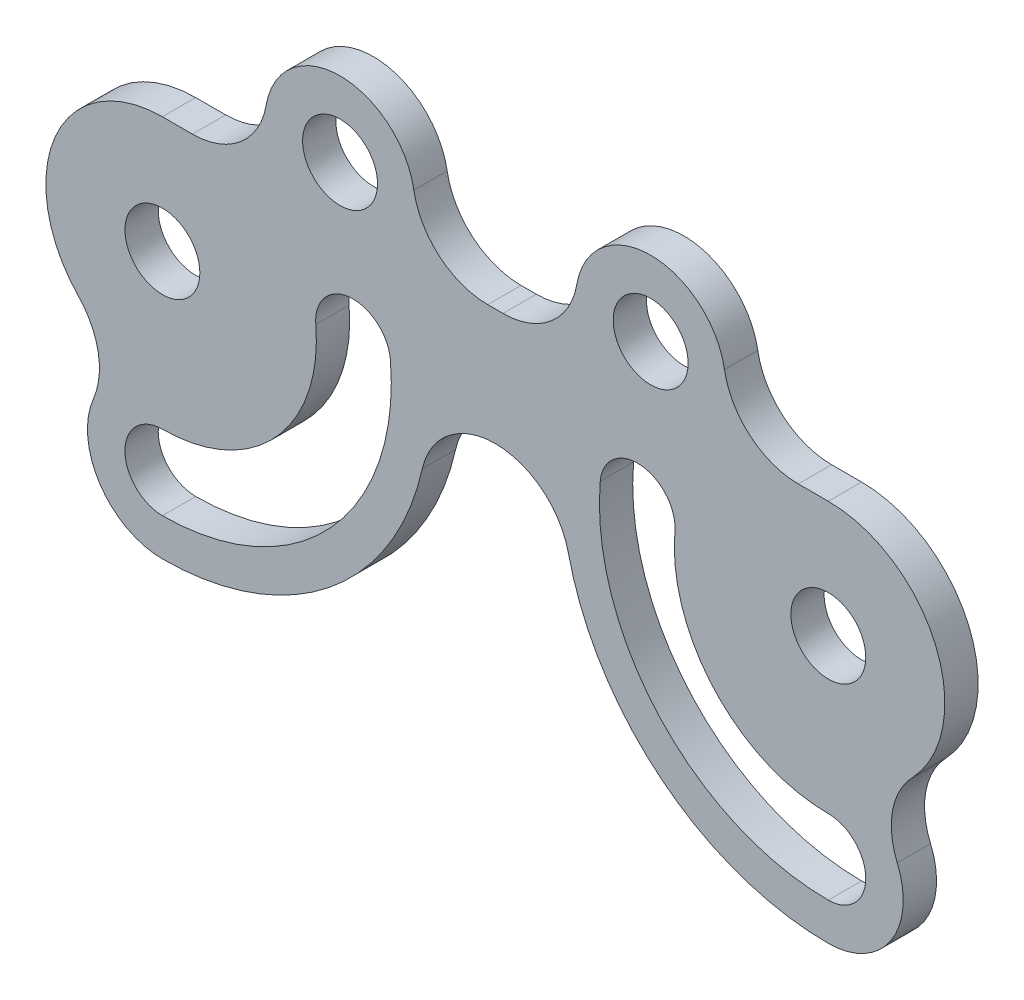
ISO-10303-21;
HEADER;
FILE_DESCRIPTION(('STEP AP214'),'2;1');
FILE_NAME('part.step','',(''),(''),'','','');
FILE_SCHEMA(('AUTOMOTIVE_DESIGN { 1 0 10303 214 1 1 1 1 }'));
ENDSEC;
DATA;
#1=APPLICATION_CONTEXT('core data for automotive mechanical design processes');
#2=APPLICATION_PROTOCOL_DEFINITION('international standard','automotive_design',2000,#1);
#3=PRODUCT_CONTEXT('',#1,'mechanical');
#4=PRODUCT('Part','Part','',(#3));
#5=PRODUCT_RELATED_PRODUCT_CATEGORY('part','',(#4));
#6=PRODUCT_DEFINITION_FORMATION('','',#4);
#7=PRODUCT_DEFINITION_CONTEXT('part definition',#1,'design');
#8=PRODUCT_DEFINITION('design','',#6,#7);
#9=PRODUCT_DEFINITION_SHAPE('','',#8);
#10=(LENGTH_UNIT() NAMED_UNIT(*) SI_UNIT(.MILLI.,.METRE.));
#11=(NAMED_UNIT(*) PLANE_ANGLE_UNIT() SI_UNIT($,.RADIAN.));
#12=(NAMED_UNIT(*) SI_UNIT($,.STERADIAN.) SOLID_ANGLE_UNIT());
#13=UNCERTAINTY_MEASURE_WITH_UNIT(LENGTH_MEASURE(1.E-05),#10,'distance_accuracy_value','');
#14=(GEOMETRIC_REPRESENTATION_CONTEXT(3) GLOBAL_UNCERTAINTY_ASSIGNED_CONTEXT((#13)) GLOBAL_UNIT_ASSIGNED_CONTEXT((#10,
#11,#12)) REPRESENTATION_CONTEXT('',''));
#15=CARTESIAN_POINT('',(0.,0.,0.));
#16=DIRECTION('',(0.,0.,1.));
#17=DIRECTION('',(1.,0.,0.));
#18=AXIS2_PLACEMENT_3D('',#15,#16,#17);
#19=CARTESIAN_POINT('',(0.,-9.12812499999999,1.5875));
#20=DIRECTION('',(0.,0.,-1.));
#21=DIRECTION('',(-1.,0.,0.));
#22=AXIS2_PLACEMENT_3D('',#19,#20,#21);
#23=CYLINDRICAL_SURFACE('',#22,1.7859375);
#24=CARTESIAN_POINT('',(0.,-9.12812499999999,0.));
#25=DIRECTION('',(0.,0.,1.));
#26=DIRECTION('',(1.,0.,0.));
#27=AXIS2_PLACEMENT_3D('',#24,#25,#26);
#28=CIRCLE('',#27,1.7859375);
#29=CARTESIAN_POINT('',(0.,-7.34218749999999,0.));
#30=VERTEX_POINT('',#29);
#31=CARTESIAN_POINT('',(0.,-10.9140625,0.));
#32=VERTEX_POINT('',#31);
#33=EDGE_CURVE('E378',#30,#32,#28,.T.);
#34=ORIENTED_EDGE('',*,*,#33,.F.);
#35=DIRECTION('',(0.,0.,-1.));
#36=VECTOR('',#35,1.);
#37=CARTESIAN_POINT('',(0.,-7.34218749999999,1.5875));
#38=LINE('',#37,#36);
#39=CARTESIAN_POINT('',(0.,-7.34218749999999,1.5875));
#40=VERTEX_POINT('',#39);
#41=EDGE_CURVE('E415',#40,#30,#38,.T.);
#42=ORIENTED_EDGE('',*,*,#41,.F.);
#43=CARTESIAN_POINT('',(0.,-9.12812499999999,1.5875));
#44=DIRECTION('',(0.,0.,1.));
#45=DIRECTION('',(1.,0.,0.));
#46=AXIS2_PLACEMENT_3D('',#43,#44,#45);
#47=CIRCLE('',#46,1.7859375);
#48=CARTESIAN_POINT('',(0.,-10.9140625,1.5875));
#49=VERTEX_POINT('',#48);
#50=EDGE_CURVE('E296',#40,#49,#47,.T.);
#51=ORIENTED_EDGE('',*,*,#50,.T.);
#52=DIRECTION('',(0.,0.,-1.));
#53=VECTOR('',#52,1.);
#54=CARTESIAN_POINT('',(0.,-10.9140625,1.5875));
#55=LINE('',#54,#53);
#56=EDGE_CURVE('E405',#49,#32,#55,.T.);
#57=ORIENTED_EDGE('',*,*,#56,.T.);
#58=EDGE_LOOP('',(#34,#42,#51,#57));
#59=FACE_BOUND('',#58,.T.);
#60=ADVANCED_FACE('F41',(#59),#23,.F.);
#61=CARTESIAN_POINT('',(0.,0.,1.5875));
#62=DIRECTION('',(0.,0.,-1.));
#63=DIRECTION('',(-1.,0.,0.));
#64=AXIS2_PLACEMENT_3D('',#61,#62,#63);
#65=CYLINDRICAL_SURFACE('',#64,7.34218749999999);
#66=CARTESIAN_POINT('',(0.,0.,0.));
#67=DIRECTION('',(0.,0.,1.));
#68=DIRECTION('',(1.,0.,0.));
#69=AXIS2_PLACEMENT_3D('',#66,#67,#68);
#70=CIRCLE('',#69,7.34218749999999);
#71=CARTESIAN_POINT('',(7.31424825989547,0.639913804955097,0.));
#72=VERTEX_POINT('',#71);
#73=EDGE_CURVE('E382',#72,#30,#70,.F.);
#74=ORIENTED_EDGE('',*,*,#73,.F.);
#75=DIRECTION('',(0.,0.,-1.));
#76=VECTOR('',#75,1.);
#77=CARTESIAN_POINT('',(7.31424825989547,0.639913804955097,1.5875));
#78=LINE('',#77,#76);
#79=CARTESIAN_POINT('',(7.31424825989547,0.639913804955097,1.5875));
#80=VERTEX_POINT('',#79);
#81=EDGE_CURVE('E412',#80,#72,#78,.T.);
#82=ORIENTED_EDGE('',*,*,#81,.F.);
#83=CARTESIAN_POINT('',(0.,0.,1.5875));
#84=DIRECTION('',(0.,0.,1.));
#85=DIRECTION('',(1.,0.,0.));
#86=AXIS2_PLACEMENT_3D('',#83,#84,#85);
#87=CIRCLE('',#86,7.34218749999999);
#88=EDGE_CURVE('E300',#80,#40,#87,.F.);
#89=ORIENTED_EDGE('',*,*,#88,.T.);
#90=ORIENTED_EDGE('',*,*,#41,.T.);
#91=EDGE_LOOP('',(#74,#82,#89,#90));
#92=FACE_BOUND('',#91,.T.);
#93=ADVANCED_FACE('F605',(#92),#65,.T.);
#94=CARTESIAN_POINT('',(9.0933897285187,0.7955685142685,1.5875));
#95=DIRECTION('',(0.,0.,-1.));
#96=DIRECTION('',(-1.,0.,0.));
#97=AXIS2_PLACEMENT_3D('',#94,#95,#96);
#98=CYLINDRICAL_SURFACE('',#97,1.7859375);
#99=CARTESIAN_POINT('',(9.0933897285187,0.7955685142685,0.));
#100=DIRECTION('',(0.,0.,1.));
#101=DIRECTION('',(1.,0.,0.));
#102=AXIS2_PLACEMENT_3D('',#99,#100,#101);
#103=CIRCLE('',#102,1.7859375);
#104=CARTESIAN_POINT('',(10.8725311971419,0.951223223581902,0.));
#105=VERTEX_POINT('',#104);
#106=EDGE_CURVE('E386',#105,#72,#103,.T.);
#107=ORIENTED_EDGE('',*,*,#106,.F.);
#108=DIRECTION('',(0.,0.,-1.));
#109=VECTOR('',#108,1.);
#110=CARTESIAN_POINT('',(10.8725311971419,0.951223223581902,1.5875));
#111=LINE('',#110,#109);
#112=CARTESIAN_POINT('',(10.8725311971419,0.951223223581902,1.5875));
#113=VERTEX_POINT('',#112);
#114=EDGE_CURVE('E408',#113,#105,#111,.T.);
#115=ORIENTED_EDGE('',*,*,#114,.F.);
#116=CARTESIAN_POINT('',(9.0933897285187,0.7955685142685,1.5875));
#117=DIRECTION('',(0.,0.,1.));
#118=DIRECTION('',(1.,0.,0.));
#119=AXIS2_PLACEMENT_3D('',#116,#117,#118);
#120=CIRCLE('',#119,1.7859375);
#121=EDGE_CURVE('E304',#113,#80,#120,.T.);
#122=ORIENTED_EDGE('',*,*,#121,.T.);
#123=ORIENTED_EDGE('',*,*,#81,.T.);
#124=EDGE_LOOP('',(#107,#115,#122,#123));
#125=FACE_BOUND('',#124,.T.);
#126=ADVANCED_FACE('F611',(#125),#98,.F.);
#127=CARTESIAN_POINT('',(0.,0.,1.5875));
#128=DIRECTION('',(0.,0.,-1.));
#129=DIRECTION('',(-1.,0.,0.));
#130=AXIS2_PLACEMENT_3D('',#127,#128,#129);
#131=CYLINDRICAL_SURFACE('',#130,5.55625);
#132=CARTESIAN_POINT('',(0.,0.,0.));
#133=DIRECTION('',(0.,0.,1.));
#134=DIRECTION('',(1.,0.,0.));
#135=AXIS2_PLACEMENT_3D('',#132,#133,#134);
#136=CIRCLE('',#135,5.55625);
#137=CARTESIAN_POINT('',(0.,5.55625,0.));
#138=VERTEX_POINT('',#137);
#139=CARTESIAN_POINT('',(-4.00163634023209,-3.85471408317581,0.));
#140=VERTEX_POINT('',#139);
#141=EDGE_CURVE('E338',#138,#140,#136,.T.);
#142=ORIENTED_EDGE('',*,*,#141,.T.);
#143=DIRECTION('',(0.,0.,-1.));
#144=VECTOR('',#143,1.);
#145=CARTESIAN_POINT('',(-4.00163634023209,-3.85471408317581,1.5875));
#146=LINE('',#145,#144);
#147=CARTESIAN_POINT('',(-4.00163634023209,-3.85471408317581,1.5875));
#148=VERTEX_POINT('',#147);
#149=EDGE_CURVE('E456',#140,#148,#146,.F.);
#150=ORIENTED_EDGE('',*,*,#149,.T.);
#151=CARTESIAN_POINT('',(0.,0.,1.5875));
#152=DIRECTION('',(0.,0.,1.));
#153=DIRECTION('',(1.,0.,0.));
#154=AXIS2_PLACEMENT_3D('',#151,#152,#153);
#155=CIRCLE('',#154,5.55625);
#156=CARTESIAN_POINT('',(0.,5.55625,1.5875));
#157=VERTEX_POINT('',#156);
#158=EDGE_CURVE('E257',#157,#148,#155,.T.);
#159=ORIENTED_EDGE('',*,*,#158,.F.);
#160=DIRECTION('',(0.,0.,-1.));
#161=VECTOR('',#160,1.);
#162=CARTESIAN_POINT('',(0.,5.55625,1.5875));
#163=LINE('',#162,#161);
#164=EDGE_CURVE('E245',#157,#138,#163,.T.);
#165=ORIENTED_EDGE('',*,*,#164,.T.);
#166=EDGE_LOOP('',(#142,#150,#159,#165));
#167=FACE_BOUND('',#166,.T.);
#168=ADVANCED_FACE('F589',(#167),#131,.T.);
#169=CARTESIAN_POINT('',(0.,-9.12812499999999,1.5875));
#170=DIRECTION('',(0.,0.,-1.));
#171=DIRECTION('',(-1.,0.,0.));
#172=AXIS2_PLACEMENT_3D('',#169,#170,#171);
#173=CYLINDRICAL_SURFACE('',#172,3.57187499999999);
#174=CARTESIAN_POINT('',(0.,-9.12812499999999,1.5875));
#175=DIRECTION('',(0.,0.,1.));
#176=DIRECTION('',(1.,0.,0.));
#177=AXIS2_PLACEMENT_3D('',#174,#175,#176);
#178=CIRCLE('',#177,3.57187499999999);
#179=CARTESIAN_POINT('',(-3.2870584223335,-7.7304347826087,1.5875));
#180=VERTEX_POINT('',#179);
#181=CARTESIAN_POINT('',(0.,-12.7,1.5875));
#182=VERTEX_POINT('',#181);
#183=EDGE_CURVE('E261',#180,#182,#178,.T.);
#184=ORIENTED_EDGE('',*,*,#183,.F.);
#185=DIRECTION('',(0.,0.,-1.));
#186=VECTOR('',#185,1.);
#187=CARTESIAN_POINT('',(-3.2870584223335,-7.7304347826087,1.5875));
#188=LINE('',#187,#186);
#189=CARTESIAN_POINT('',(-3.2870584223335,-7.7304347826087,0.));
#190=VERTEX_POINT('',#189);
#191=EDGE_CURVE('E452',#180,#190,#188,.T.);
#192=ORIENTED_EDGE('',*,*,#191,.T.);
#193=CARTESIAN_POINT('',(0.,-9.12812499999999,0.));
#194=DIRECTION('',(0.,0.,1.));
#195=DIRECTION('',(1.,0.,0.));
#196=AXIS2_PLACEMENT_3D('',#193,#194,#195);
#197=CIRCLE('',#196,3.57187499999999);
#198=CARTESIAN_POINT('',(0.,-12.7,0.));
#199=VERTEX_POINT('',#198);
#200=EDGE_CURVE('E342',#190,#199,#197,.T.);
#201=ORIENTED_EDGE('',*,*,#200,.T.);
#202=DIRECTION('',(0.,0.,-1.));
#203=VECTOR('',#202,1.);
#204=CARTESIAN_POINT('',(0.,-12.7,1.5875));
#205=LINE('',#204,#203);
#206=EDGE_CURVE('E409',#182,#199,#205,.T.);
#207=ORIENTED_EDGE('',*,*,#206,.F.);
#208=EDGE_LOOP('',(#184,#192,#201,#207));
#209=FACE_BOUND('',#208,.T.);
#210=ADVANCED_FACE('F584',(#209),#173,.T.);
#211=CARTESIAN_POINT('',(0.,0.,1.5875));
#212=DIRECTION('',(0.,0.,-1.));
#213=DIRECTION('',(-1.,0.,0.));
#214=AXIS2_PLACEMENT_3D('',#211,#212,#213);
#215=CYLINDRICAL_SURFACE('',#214,12.7);
#216=CARTESIAN_POINT('',(0.,0.,0.));
#217=DIRECTION('',(0.,0.,1.));
#218=DIRECTION('',(1.,0.,0.));
#219=AXIS2_PLACEMENT_3D('',#216,#217,#218);
#220=CIRCLE('',#219,12.7);
#221=CARTESIAN_POINT('',(12.390243902439,-2.78780487804878,0.));
#222=VERTEX_POINT('',#221);
#223=EDGE_CURVE('E345',#199,#222,#220,.T.);
#224=ORIENTED_EDGE('',*,*,#223,.T.);
#225=DIRECTION('',(0.,0.,-1.));
#226=VECTOR('',#225,1.);
#227=CARTESIAN_POINT('',(12.390243902439,-2.78780487804878,1.5875));
#228=LINE('',#227,#226);
#229=CARTESIAN_POINT('',(12.390243902439,-2.78780487804878,1.5875));
#230=VERTEX_POINT('',#229);
#231=EDGE_CURVE('E449',#222,#230,#228,.F.);
#232=ORIENTED_EDGE('',*,*,#231,.T.);
#233=CARTESIAN_POINT('',(0.,0.,1.5875));
#234=DIRECTION('',(0.,0.,1.));
#235=DIRECTION('',(1.,0.,0.));
#236=AXIS2_PLACEMENT_3D('',#233,#234,#235);
#237=CIRCLE('',#236,12.7);
#238=EDGE_CURVE('E264',#182,#230,#237,.T.);
#239=ORIENTED_EDGE('',*,*,#238,.F.);
#240=ORIENTED_EDGE('',*,*,#206,.T.);
#241=EDGE_LOOP('',(#224,#232,#239,#240));
#242=FACE_BOUND('',#241,.T.);
#243=ADVANCED_FACE('F579',(#242),#215,.T.);
#244=CARTESIAN_POINT('',(31.75,0.,1.5875));
#245=DIRECTION('',(0.,0.,-1.));
#246=DIRECTION('',(-1.,0.,0.));
#247=AXIS2_PLACEMENT_3D('',#244,#245,#246);
#248=CYLINDRICAL_SURFACE('',#247,12.7);
#249=CARTESIAN_POINT('',(31.75,0.,1.5875));
#250=DIRECTION('',(0.,0.,1.));
#251=DIRECTION('',(1.,0.,0.));
#252=AXIS2_PLACEMENT_3D('',#249,#250,#251);
#253=CIRCLE('',#252,12.7);
#254=CARTESIAN_POINT('',(19.359756097561,-2.78780487804878,1.5875));
#255=VERTEX_POINT('',#254);
#256=CARTESIAN_POINT('',(31.75,-12.7,1.5875));
#257=VERTEX_POINT('',#256);
#258=EDGE_CURVE('E267',#255,#257,#253,.T.);
#259=ORIENTED_EDGE('',*,*,#258,.F.);
#260=DIRECTION('',(0.,0.,-1.));
#261=VECTOR('',#260,1.);
#262=CARTESIAN_POINT('',(19.359756097561,-2.78780487804878,1.5875));
#263=LINE('',#262,#261);
#264=CARTESIAN_POINT('',(19.359756097561,-2.78780487804878,0.));
#265=VERTEX_POINT('',#264);
#266=EDGE_CURVE('E445',#255,#265,#263,.T.);
#267=ORIENTED_EDGE('',*,*,#266,.T.);
#268=CARTESIAN_POINT('',(31.75,0.,0.));
#269=DIRECTION('',(0.,0.,1.));
#270=DIRECTION('',(1.,0.,0.));
#271=AXIS2_PLACEMENT_3D('',#268,#269,#270);
#272=CIRCLE('',#271,12.7);
#273=CARTESIAN_POINT('',(31.75,-12.7,0.));
#274=VERTEX_POINT('',#273);
#275=EDGE_CURVE('E349',#265,#274,#272,.T.);
#276=ORIENTED_EDGE('',*,*,#275,.T.);
#277=DIRECTION('',(0.,0.,-1.));
#278=VECTOR('',#277,1.);
#279=CARTESIAN_POINT('',(31.75,-12.7,1.5875));
#280=LINE('',#279,#278);
#281=EDGE_CURVE('E425',#257,#274,#280,.T.);
#282=ORIENTED_EDGE('',*,*,#281,.F.);
#283=EDGE_LOOP('',(#259,#267,#276,#282));
#284=FACE_BOUND('',#283,.T.);
#285=ADVANCED_FACE('F637',(#284),#248,.T.);
#286=CARTESIAN_POINT('',(31.75,-9.12812499999999,1.5875));
#287=DIRECTION('',(0.,0.,-1.));
#288=DIRECTION('',(-1.,0.,0.));
#289=AXIS2_PLACEMENT_3D('',#286,#287,#288);
#290=CYLINDRICAL_SURFACE('',#289,3.57187499999998);
#291=CARTESIAN_POINT('',(31.75,-9.12812499999999,0.));
#292=DIRECTION('',(0.,0.,1.));
#293=DIRECTION('',(1.,0.,0.));
#294=AXIS2_PLACEMENT_3D('',#291,#292,#293);
#295=CIRCLE('',#294,3.57187499999998);
#296=CARTESIAN_POINT('',(35.0370584223335,-7.7304347826087,0.));
#297=VERTEX_POINT('',#296);
#298=EDGE_CURVE('E352',#274,#297,#295,.T.);
#299=ORIENTED_EDGE('',*,*,#298,.T.);
#300=DIRECTION('',(0.,0.,-1.));
#301=VECTOR('',#300,1.);
#302=CARTESIAN_POINT('',(35.0370584223335,-7.7304347826087,1.5875));
#303=LINE('',#302,#301);
#304=CARTESIAN_POINT('',(35.0370584223335,-7.7304347826087,1.5875));
#305=VERTEX_POINT('',#304);
#306=EDGE_CURVE('E442',#297,#305,#303,.F.);
#307=ORIENTED_EDGE('',*,*,#306,.T.);
#308=CARTESIAN_POINT('',(31.75,-9.12812499999999,1.5875));
#309=DIRECTION('',(0.,0.,1.));
#310=DIRECTION('',(1.,0.,0.));
#311=AXIS2_PLACEMENT_3D('',#308,#309,#310);
#312=CIRCLE('',#311,3.57187499999998);
#313=EDGE_CURVE('E270',#257,#305,#312,.T.);
#314=ORIENTED_EDGE('',*,*,#313,.F.);
#315=ORIENTED_EDGE('',*,*,#281,.T.);
#316=EDGE_LOOP('',(#299,#307,#314,#315));
#317=FACE_BOUND('',#316,.T.);
#318=ADVANCED_FACE('F634',(#317),#290,.T.);
#319=CARTESIAN_POINT('',(31.75,0.,1.5875));
#320=DIRECTION('',(0.,0.,-1.));
#321=DIRECTION('',(-1.,0.,0.));
#322=AXIS2_PLACEMENT_3D('',#319,#320,#321);
#323=CYLINDRICAL_SURFACE('',#322,5.55625);
#324=CARTESIAN_POINT('',(31.75,0.,1.5875));
#325=DIRECTION('',(0.,0.,1.));
#326=DIRECTION('',(1.,0.,0.));
#327=AXIS2_PLACEMENT_3D('',#324,#325,#326);
#328=CIRCLE('',#327,5.55625);
#329=CARTESIAN_POINT('',(35.7516363402321,-3.85471408317581,1.5875));
#330=VERTEX_POINT('',#329);
#331=CARTESIAN_POINT('',(31.75,5.55625,1.5875));
#332=VERTEX_POINT('',#331);
#333=EDGE_CURVE('E274',#330,#332,#328,.T.);
#334=ORIENTED_EDGE('',*,*,#333,.F.);
#335=DIRECTION('',(0.,0.,-1.));
#336=VECTOR('',#335,1.);
#337=CARTESIAN_POINT('',(35.7516363402321,-3.85471408317581,1.5875));
#338=LINE('',#337,#336);
#339=CARTESIAN_POINT('',(35.7516363402321,-3.85471408317581,0.));
#340=VERTEX_POINT('',#339);
#341=EDGE_CURVE('E418',#330,#340,#338,.T.);
#342=ORIENTED_EDGE('',*,*,#341,.T.);
#343=CARTESIAN_POINT('',(31.75,0.,0.));
#344=DIRECTION('',(0.,0.,1.));
#345=DIRECTION('',(1.,0.,0.));
#346=AXIS2_PLACEMENT_3D('',#343,#344,#345);
#347=CIRCLE('',#346,5.55625);
#348=CARTESIAN_POINT('',(31.75,5.55625,0.));
#349=VERTEX_POINT('',#348);
#350=EDGE_CURVE('E356',#340,#349,#347,.T.);
#351=ORIENTED_EDGE('',*,*,#350,.T.);
#352=DIRECTION('',(0.,0.,-1.));
#353=VECTOR('',#352,1.);
#354=CARTESIAN_POINT('',(31.75,5.55625,1.5875));
#355=LINE('',#354,#353);
#356=EDGE_CURVE('E421',#332,#349,#355,.T.);
#357=ORIENTED_EDGE('',*,*,#356,.F.);
#358=EDGE_LOOP('',(#334,#342,#351,#357));
#359=FACE_BOUND('',#358,.T.);
#360=ADVANCED_FACE('F561',(#359),#323,.T.);
#361=CARTESIAN_POINT('',(0.,5.55625,1.5875));
#362=DIRECTION('',(0.,1.,0.));
#363=DIRECTION('',(0.,0.,1.));
#364=AXIS2_PLACEMENT_3D('',#361,#362,#363);
#365=PLANE('',#364);
#366=DIRECTION('',(1.,0.,0.));
#367=VECTOR('',#366,1.);
#368=CARTESIAN_POINT('',(0.,5.55625,0.));
#369=LINE('',#368,#367);
#370=CARTESIAN_POINT('',(30.3187270237768,5.55625,0.));
#371=VERTEX_POINT('',#370);
#372=EDGE_CURVE('E360',#371,#349,#369,.T.);
#373=ORIENTED_EDGE('',*,*,#372,.F.);
#374=DIRECTION('',(0.,0.,-1.));
#375=VECTOR('',#374,1.);
#376=CARTESIAN_POINT('',(30.3187270237768,5.55625,1.5875));
#377=LINE('',#376,#375);
#378=CARTESIAN_POINT('',(30.3187270237768,5.55625,1.5875));
#379=VERTEX_POINT('',#378);
#380=EDGE_CURVE('E466',#371,#379,#377,.F.);
#381=ORIENTED_EDGE('',*,*,#380,.T.);
#382=DIRECTION('',(1.,0.,0.));
#383=VECTOR('',#382,1.);
#384=CARTESIAN_POINT('',(0.,5.55625,1.5875));
#385=LINE('',#384,#383);
#386=EDGE_CURVE('E278',#379,#332,#385,.T.);
#387=ORIENTED_EDGE('',*,*,#386,.T.);
#388=ORIENTED_EDGE('',*,*,#356,.T.);
#389=EDGE_LOOP('',(#373,#381,#387,#388));
#390=FACE_BOUND('',#389,.T.);
#391=ADVANCED_FACE('F553',(#390),#365,.T.);
#392=CARTESIAN_POINT('',(23.2792291087349,7.91213438876139,1.5875));
#393=DIRECTION('',(0.,0.,-1.));
#394=DIRECTION('',(-1.,0.,0.));
#395=AXIS2_PLACEMENT_3D('',#392,#393,#394);
#396=CYLINDRICAL_SURFACE('',#395,3.57187500000001);
#397=CARTESIAN_POINT('',(23.2792291087349,7.91213438876139,1.5875));
#398=DIRECTION('',(0.,0.,1.));
#399=DIRECTION('',(1.,0.,0.));
#400=AXIS2_PLACEMENT_3D('',#397,#398,#399);
#401=CIRCLE('',#400,3.57187500000001);
#402=CARTESIAN_POINT('',(26.7989780662559,8.5201296943807,1.5875));
#403=VERTEX_POINT('',#402);
#404=CARTESIAN_POINT('',(19.7594801512139,8.5201296943807,1.5875));
#405=VERTEX_POINT('',#404);
#406=EDGE_CURVE('E284',#403,#405,#401,.T.);
#407=ORIENTED_EDGE('',*,*,#406,.F.);
#408=DIRECTION('',(0.,0.,-1.));
#409=VECTOR('',#408,1.);
#410=CARTESIAN_POINT('',(26.7989780662559,8.5201296943807,1.5875));
#411=LINE('',#410,#409);
#412=CARTESIAN_POINT('',(26.7989780662559,8.5201296943807,0.));
#413=VERTEX_POINT('',#412);
#414=EDGE_CURVE('E462',#403,#413,#411,.T.);
#415=ORIENTED_EDGE('',*,*,#414,.T.);
#416=CARTESIAN_POINT('',(23.2792291087349,7.91213438876139,0.));
#417=DIRECTION('',(0.,0.,1.));
#418=DIRECTION('',(1.,0.,0.));
#419=AXIS2_PLACEMENT_3D('',#416,#417,#418);
#420=CIRCLE('',#419,3.57187500000001);
#421=CARTESIAN_POINT('',(19.7594801512139,8.5201296943807,0.));
#422=VERTEX_POINT('',#421);
#423=EDGE_CURVE('E366',#413,#422,#420,.T.);
#424=ORIENTED_EDGE('',*,*,#423,.T.);
#425=DIRECTION('',(0.,0.,-1.));
#426=VECTOR('',#425,1.);
#427=CARTESIAN_POINT('',(19.7594801512139,8.5201296943807,1.5875));
#428=LINE('',#427,#426);
#429=EDGE_CURVE('E459',#422,#405,#428,.F.);
#430=ORIENTED_EDGE('',*,*,#429,.T.);
#431=EDGE_LOOP('',(#407,#415,#424,#430));
#432=FACE_BOUND('',#431,.T.);
#433=ADVANCED_FACE('F628',(#432),#396,.T.);
#434=CARTESIAN_POINT('',(15.510268806307,5.55625,0.));
#435=VERTEX_POINT('',#434);
#436=CARTESIAN_POINT('',(16.239731193693,5.55625,0.));
#437=VERTEX_POINT('',#436);
#438=EDGE_CURVE('E361',#435,#437,#369,.T.);
#439=ORIENTED_EDGE('',*,*,#438,.F.);
#440=DIRECTION('',(0.,0.,-1.));
#441=VECTOR('',#440,1.);
#442=CARTESIAN_POINT('',(15.510268806307,5.55625,1.5875));
#443=LINE('',#442,#441);
#444=CARTESIAN_POINT('',(15.510268806307,5.55625,1.5875));
#445=VERTEX_POINT('',#444);
#446=EDGE_CURVE('E480',#435,#445,#443,.F.);
#447=ORIENTED_EDGE('',*,*,#446,.T.);
#448=CARTESIAN_POINT('',(16.239731193693,5.55625,1.5875));
#449=VERTEX_POINT('',#448);
#450=EDGE_CURVE('E279',#445,#449,#385,.T.);
#451=ORIENTED_EDGE('',*,*,#450,.T.);
#452=DIRECTION('',(0.,0.,-1.));
#453=VECTOR('',#452,1.);
#454=CARTESIAN_POINT('',(16.239731193693,5.55625,1.5875));
#455=LINE('',#454,#453);
#456=EDGE_CURVE('E476',#449,#437,#455,.T.);
#457=ORIENTED_EDGE('',*,*,#456,.T.);
#458=EDGE_LOOP('',(#439,#447,#451,#457));
#459=FACE_BOUND('',#458,.T.);
#460=ADVANCED_FACE('F625',(#459),#365,.T.);
#461=CARTESIAN_POINT('',(8.47077089126509,7.91213438876139,1.5875));
#462=DIRECTION('',(0.,0.,-1.));
#463=DIRECTION('',(-1.,0.,0.));
#464=AXIS2_PLACEMENT_3D('',#461,#462,#463);
#465=CYLINDRICAL_SURFACE('',#464,3.57187499999999);
#466=CARTESIAN_POINT('',(8.47077089126509,7.91213438876139,1.5875));
#467=DIRECTION('',(0.,0.,1.));
#468=DIRECTION('',(1.,0.,0.));
#469=AXIS2_PLACEMENT_3D('',#466,#467,#468);
#470=CIRCLE('',#469,3.57187499999999);
#471=CARTESIAN_POINT('',(11.990519848786,8.52012969438069,1.5875));
#472=VERTEX_POINT('',#471);
#473=CARTESIAN_POINT('',(4.95102193374414,8.52012969438069,1.5875));
#474=VERTEX_POINT('',#473);
#475=EDGE_CURVE('E283',#472,#474,#470,.T.);
#476=ORIENTED_EDGE('',*,*,#475,.F.);
#477=DIRECTION('',(0.,0.,-1.));
#478=VECTOR('',#477,1.);
#479=CARTESIAN_POINT('',(11.990519848786,8.52012969438069,1.5875));
#480=LINE('',#479,#478);
#481=CARTESIAN_POINT('',(11.990519848786,8.52012969438069,0.));
#482=VERTEX_POINT('',#481);
#483=EDGE_CURVE('E472',#472,#482,#480,.T.);
#484=ORIENTED_EDGE('',*,*,#483,.T.);
#485=CARTESIAN_POINT('',(8.47077089126509,7.91213438876139,0.));
#486=DIRECTION('',(0.,0.,1.));
#487=DIRECTION('',(1.,0.,0.));
#488=AXIS2_PLACEMENT_3D('',#485,#486,#487);
#489=CIRCLE('',#488,3.57187499999999);
#490=CARTESIAN_POINT('',(4.95102193374414,8.52012969438069,0.));
#491=VERTEX_POINT('',#490);
#492=EDGE_CURVE('E365',#482,#491,#489,.T.);
#493=ORIENTED_EDGE('',*,*,#492,.T.);
#494=DIRECTION('',(0.,0.,-1.));
#495=VECTOR('',#494,1.);
#496=CARTESIAN_POINT('',(4.95102193374414,8.52012969438069,1.5875));
#497=LINE('',#496,#495);
#498=EDGE_CURVE('E469',#491,#474,#497,.F.);
#499=ORIENTED_EDGE('',*,*,#498,.T.);
#500=EDGE_LOOP('',(#476,#484,#493,#499));
#501=FACE_BOUND('',#500,.T.);
#502=ADVANCED_FACE('F539',(#501),#465,.T.);
#503=CARTESIAN_POINT('',(31.75,0.,1.5875));
#504=DIRECTION('',(0.,0.,-1.));
#505=DIRECTION('',(-1.,0.,0.));
#506=AXIS2_PLACEMENT_3D('',#503,#504,#505);
#507=CYLINDRICAL_SURFACE('',#506,7.34218749999999);
#508=CARTESIAN_POINT('',(31.75,0.,0.));
#509=DIRECTION('',(0.,0.,1.));
#510=DIRECTION('',(1.,0.,0.));
#511=AXIS2_PLACEMENT_3D('',#508,#509,#510);
#512=CIRCLE('',#511,7.34218749999999);
#513=CARTESIAN_POINT('',(24.4357517401045,0.639913804955095,0.));
#514=VERTEX_POINT('',#513);
#515=CARTESIAN_POINT('',(31.75,-7.34218749999999,0.));
#516=VERTEX_POINT('',#515);
#517=EDGE_CURVE('E240',#514,#516,#512,.T.);
#518=ORIENTED_EDGE('',*,*,#517,.T.);
#519=DIRECTION('',(0.,0.,-1.));
#520=VECTOR('',#519,1.);
#521=CARTESIAN_POINT('',(31.75,-7.34218749999999,1.5875));
#522=LINE('',#521,#520);
#523=CARTESIAN_POINT('',(31.75,-7.34218749999999,1.5875));
#524=VERTEX_POINT('',#523);
#525=EDGE_CURVE('E237',#524,#516,#522,.T.);
#526=ORIENTED_EDGE('',*,*,#525,.F.);
#527=CARTESIAN_POINT('',(31.75,0.,1.5875));
#528=DIRECTION('',(0.,0.,1.));
#529=DIRECTION('',(1.,0.,0.));
#530=AXIS2_PLACEMENT_3D('',#527,#528,#529);
#531=CIRCLE('',#530,7.34218749999999);
#532=CARTESIAN_POINT('',(24.4357517401045,0.639913804955095,1.5875));
#533=VERTEX_POINT('',#532);
#534=EDGE_CURVE('E223',#533,#524,#531,.T.);
#535=ORIENTED_EDGE('',*,*,#534,.F.);
#536=DIRECTION('',(0.,0.,-1.));
#537=VECTOR('',#536,1.);
#538=CARTESIAN_POINT('',(24.4357517401045,0.639913804955095,1.5875));
#539=LINE('',#538,#537);
#540=EDGE_CURVE('E324',#533,#514,#539,.T.);
#541=ORIENTED_EDGE('',*,*,#540,.T.);
#542=EDGE_LOOP('',(#518,#526,#535,#541));
#543=FACE_BOUND('',#542,.T.);
#544=ADVANCED_FACE('F238',(#543),#507,.T.);
#545=CARTESIAN_POINT('',(31.75,-9.12812499999999,1.5875));
#546=DIRECTION('',(0.,0.,-1.));
#547=DIRECTION('',(-1.,0.,0.));
#548=AXIS2_PLACEMENT_3D('',#545,#546,#547);
#549=CYLINDRICAL_SURFACE('',#548,1.7859375);
#550=CARTESIAN_POINT('',(31.75,-9.12812499999999,0.));
#551=DIRECTION('',(0.,0.,1.));
#552=DIRECTION('',(1.,0.,0.));
#553=AXIS2_PLACEMENT_3D('',#550,#551,#552);
#554=CIRCLE('',#553,1.7859375);
#555=CARTESIAN_POINT('',(31.75,-10.9140625,0.));
#556=VERTEX_POINT('',#555);
#557=EDGE_CURVE('E327',#556,#516,#554,.T.);
#558=ORIENTED_EDGE('',*,*,#557,.F.);
#559=DIRECTION('',(0.,0.,-1.));
#560=VECTOR('',#559,1.);
#561=CARTESIAN_POINT('',(31.75,-10.9140625,1.5875));
#562=LINE('',#561,#560);
#563=CARTESIAN_POINT('',(31.75,-10.9140625,1.5875));
#564=VERTEX_POINT('',#563);
#565=EDGE_CURVE('E246',#564,#556,#562,.T.);
#566=ORIENTED_EDGE('',*,*,#565,.F.);
#567=CARTESIAN_POINT('',(31.75,-9.12812499999999,1.5875));
#568=DIRECTION('',(0.,0.,1.));
#569=DIRECTION('',(1.,0.,0.));
#570=AXIS2_PLACEMENT_3D('',#567,#568,#569);
#571=CIRCLE('',#570,1.7859375);
#572=EDGE_CURVE('E228',#564,#524,#571,.T.);
#573=ORIENTED_EDGE('',*,*,#572,.T.);
#574=ORIENTED_EDGE('',*,*,#525,.T.);
#575=EDGE_LOOP('',(#558,#566,#573,#574));
#576=FACE_BOUND('',#575,.T.);
#577=ADVANCED_FACE('F248',(#576),#549,.F.);
#578=CARTESIAN_POINT('',(31.75,0.,1.5875));
#579=DIRECTION('',(0.,0.,-1.));
#580=DIRECTION('',(-1.,0.,0.));
#581=AXIS2_PLACEMENT_3D('',#578,#579,#580);
#582=CYLINDRICAL_SURFACE('',#581,10.9140625);
#583=CARTESIAN_POINT('',(31.75,0.,0.));
#584=DIRECTION('',(0.,0.,1.));
#585=DIRECTION('',(1.,0.,0.));
#586=AXIS2_PLACEMENT_3D('',#583,#584,#585);
#587=CIRCLE('',#586,10.9140625);
#588=CARTESIAN_POINT('',(20.8774688028581,0.9512232235819,0.));
#589=VERTEX_POINT('',#588);
#590=EDGE_CURVE('E330',#589,#556,#587,.T.);
#591=ORIENTED_EDGE('',*,*,#590,.F.);
#592=DIRECTION('',(0.,0.,-1.));
#593=VECTOR('',#592,1.);
#594=CARTESIAN_POINT('',(20.8774688028581,0.9512232235819,1.5875));
#595=LINE('',#594,#593);
#596=CARTESIAN_POINT('',(20.8774688028581,0.9512232235819,1.5875));
#597=VERTEX_POINT('',#596);
#598=EDGE_CURVE('E434',#597,#589,#595,.T.);
#599=ORIENTED_EDGE('',*,*,#598,.F.);
#600=CARTESIAN_POINT('',(31.75,0.,1.5875));
#601=DIRECTION('',(0.,0.,1.));
#602=DIRECTION('',(1.,0.,0.));
#603=AXIS2_PLACEMENT_3D('',#600,#601,#602);
#604=CIRCLE('',#603,10.9140625);
#605=EDGE_CURVE('E250',#597,#564,#604,.T.);
#606=ORIENTED_EDGE('',*,*,#605,.T.);
#607=ORIENTED_EDGE('',*,*,#565,.T.);
#608=EDGE_LOOP('',(#591,#599,#606,#607));
#609=FACE_BOUND('',#608,.T.);
#610=ADVANCED_FACE('F652',(#609),#582,.F.);
#611=CARTESIAN_POINT('',(31.75,0.,1.5875));
#612=DIRECTION('',(0.,0.,-1.));
#613=DIRECTION('',(-1.,0.,0.));
#614=AXIS2_PLACEMENT_3D('',#611,#612,#613);
#615=CYLINDRICAL_SURFACE('',#614,1.7859375);
#616=CARTESIAN_POINT('',(31.75,0.,1.5875));
#617=DIRECTION('',(0.,0.,1.));
#618=DIRECTION('',(1.,0.,0.));
#619=AXIS2_PLACEMENT_3D('',#616,#617,#618);
#620=CIRCLE('',#619,1.7859375);
#621=CARTESIAN_POINT('',(33.5359375,0.,1.5875));
#622=VERTEX_POINT('',#621);
#623=EDGE_CURVE('E316',#622,#622,#620,.T.);
#624=ORIENTED_EDGE('',*,*,#623,.T.);
#625=EDGE_LOOP('',(#624));
#626=FACE_BOUND('',#625,.T.);
#627=CARTESIAN_POINT('',(31.75,0.,0.));
#628=DIRECTION('',(0.,0.,1.));
#629=DIRECTION('',(1.,0.,0.));
#630=AXIS2_PLACEMENT_3D('',#627,#628,#629);
#631=CIRCLE('',#630,1.7859375);
#632=CARTESIAN_POINT('',(33.5359375,0.,0.));
#633=VERTEX_POINT('',#632);
#634=EDGE_CURVE('E398',#633,#633,#631,.T.);
#635=ORIENTED_EDGE('',*,*,#634,.F.);
#636=EDGE_LOOP('',(#635));
#637=FACE_BOUND('',#636,.T.);
#638=ADVANCED_FACE('F655',(#626,#637),#615,.F.);
#639=CARTESIAN_POINT('',(0.,0.,1.5875));
#640=DIRECTION('',(0.,0.,-1.));
#641=DIRECTION('',(-1.,0.,0.));
#642=AXIS2_PLACEMENT_3D('',#639,#640,#641);
#643=CYLINDRICAL_SURFACE('',#642,1.7859375);
#644=CARTESIAN_POINT('',(0.,0.,1.5875));
#645=DIRECTION('',(0.,0.,1.));
#646=DIRECTION('',(1.,0.,0.));
#647=AXIS2_PLACEMENT_3D('',#644,#645,#646);
#648=CIRCLE('',#647,1.7859375);
#649=CARTESIAN_POINT('',(1.7859375,0.,1.5875));
#650=VERTEX_POINT('',#649);
#651=EDGE_CURVE('E312',#650,#650,#648,.T.);
#652=ORIENTED_EDGE('',*,*,#651,.T.);
#653=EDGE_LOOP('',(#652));
#654=FACE_BOUND('',#653,.T.);
#655=CARTESIAN_POINT('',(0.,0.,0.));
#656=DIRECTION('',(0.,0.,1.));
#657=DIRECTION('',(1.,0.,0.));
#658=AXIS2_PLACEMENT_3D('',#655,#656,#657);
#659=CIRCLE('',#658,1.7859375);
#660=CARTESIAN_POINT('',(1.7859375,0.,0.));
#661=VERTEX_POINT('',#660);
#662=EDGE_CURVE('E394',#661,#661,#659,.T.);
#663=ORIENTED_EDGE('',*,*,#662,.F.);
#664=EDGE_LOOP('',(#663));
#665=FACE_BOUND('',#664,.T.);
#666=ADVANCED_FACE('F811',(#654,#665),#643,.F.);
#667=CARTESIAN_POINT('',(0.,0.,1.5875));
#668=DIRECTION('',(0.,0.,-1.));
#669=DIRECTION('',(-1.,0.,0.));
#670=AXIS2_PLACEMENT_3D('',#667,#668,#669);
#671=CYLINDRICAL_SURFACE('',#670,10.9140625);
#672=CARTESIAN_POINT('',(0.,0.,0.));
#673=DIRECTION('',(0.,0.,1.));
#674=DIRECTION('',(1.,0.,0.));
#675=AXIS2_PLACEMENT_3D('',#672,#673,#674);
#676=CIRCLE('',#675,10.9140625);
#677=EDGE_CURVE('E390',#32,#105,#676,.T.);
#678=ORIENTED_EDGE('',*,*,#677,.F.);
#679=ORIENTED_EDGE('',*,*,#56,.F.);
#680=CARTESIAN_POINT('',(0.,0.,1.5875));
#681=DIRECTION('',(0.,0.,1.));
#682=DIRECTION('',(1.,0.,0.));
#683=AXIS2_PLACEMENT_3D('',#680,#681,#682);
#684=CIRCLE('',#683,10.9140625);
#685=EDGE_CURVE('E308',#49,#113,#684,.T.);
#686=ORIENTED_EDGE('',*,*,#685,.T.);
#687=ORIENTED_EDGE('',*,*,#114,.T.);
#688=EDGE_LOOP('',(#678,#679,#686,#687));
#689=FACE_BOUND('',#688,.T.);
#690=ADVANCED_FACE('F620',(#689),#671,.F.);
#691=CARTESIAN_POINT('',(8.47077089126509,7.91213438876139,1.5875));
#692=DIRECTION('',(0.,0.,-1.));
#693=DIRECTION('',(-1.,0.,0.));
#694=AXIS2_PLACEMENT_3D('',#691,#692,#693);
#695=CYLINDRICAL_SURFACE('',#694,1.78593749999998);
#696=CARTESIAN_POINT('',(8.47077089126509,7.91213438876139,1.5875));
#697=DIRECTION('',(0.,0.,1.));
#698=DIRECTION('',(1.,0.,0.));
#699=AXIS2_PLACEMENT_3D('',#696,#697,#698);
#700=CIRCLE('',#699,1.78593749999998);
#701=CARTESIAN_POINT('',(10.2567083912651,7.91213438876139,1.5875));
#702=VERTEX_POINT('',#701);
#703=EDGE_CURVE('E292',#702,#702,#700,.T.);
#704=ORIENTED_EDGE('',*,*,#703,.T.);
#705=EDGE_LOOP('',(#704));
#706=FACE_BOUND('',#705,.T.);
#707=CARTESIAN_POINT('',(8.47077089126509,7.91213438876139,0.));
#708=DIRECTION('',(0.,0.,1.));
#709=DIRECTION('',(1.,0.,0.));
#710=AXIS2_PLACEMENT_3D('',#707,#708,#709);
#711=CIRCLE('',#710,1.78593749999998);
#712=CARTESIAN_POINT('',(10.2567083912651,7.91213438876139,0.));
#713=VERTEX_POINT('',#712);
#714=EDGE_CURVE('E374',#713,#713,#711,.T.);
#715=ORIENTED_EDGE('',*,*,#714,.F.);
#716=EDGE_LOOP('',(#715));
#717=FACE_BOUND('',#716,.T.);
#718=ADVANCED_FACE('F617',(#706,#717),#695,.F.);
#719=CARTESIAN_POINT('',(1.43127297622318,5.55625,1.5875));
#720=VERTEX_POINT('',#719);
#721=EDGE_CURVE('E285',#157,#720,#385,.T.);
#722=ORIENTED_EDGE('',*,*,#721,.T.);
#723=DIRECTION('',(0.,0.,-1.));
#724=VECTOR('',#723,1.);
#725=CARTESIAN_POINT('',(1.43127297622318,5.55625,1.5875));
#726=LINE('',#725,#724);
#727=CARTESIAN_POINT('',(1.43127297622318,5.55625,0.));
#728=VERTEX_POINT('',#727);
#729=EDGE_CURVE('E483',#720,#728,#726,.T.);
#730=ORIENTED_EDGE('',*,*,#729,.T.);
#731=EDGE_CURVE('E367',#138,#728,#369,.T.);
#732=ORIENTED_EDGE('',*,*,#731,.F.);
#733=ORIENTED_EDGE('',*,*,#164,.F.);
#734=EDGE_LOOP('',(#722,#730,#732,#733));
#735=FACE_BOUND('',#734,.T.);
#736=ADVANCED_FACE('F546',(#735),#365,.T.);
#737=CARTESIAN_POINT('',(22.6566102714813,0.795568514268498,1.5875));
#738=DIRECTION('',(0.,0.,-1.));
#739=DIRECTION('',(-1.,0.,0.));
#740=AXIS2_PLACEMENT_3D('',#737,#738,#739);
#741=CYLINDRICAL_SURFACE('',#740,1.7859375);
#742=CARTESIAN_POINT('',(22.6566102714813,0.795568514268498,0.));
#743=DIRECTION('',(0.,0.,1.));
#744=DIRECTION('',(1.,0.,0.));
#745=AXIS2_PLACEMENT_3D('',#742,#743,#744);
#746=CIRCLE('',#745,1.7859375);
#747=EDGE_CURVE('E334',#514,#589,#746,.T.);
#748=ORIENTED_EDGE('',*,*,#747,.F.);
#749=ORIENTED_EDGE('',*,*,#540,.F.);
#750=CARTESIAN_POINT('',(22.6566102714813,0.795568514268498,1.5875));
#751=DIRECTION('',(0.,0.,1.));
#752=DIRECTION('',(1.,0.,0.));
#753=AXIS2_PLACEMENT_3D('',#750,#751,#752);
#754=CIRCLE('',#753,1.7859375);
#755=EDGE_CURVE('E231',#533,#597,#754,.T.);
#756=ORIENTED_EDGE('',*,*,#755,.T.);
#757=ORIENTED_EDGE('',*,*,#598,.T.);
#758=EDGE_LOOP('',(#748,#749,#756,#757));
#759=FACE_BOUND('',#758,.T.);
#760=ADVANCED_FACE('F624',(#759),#741,.F.);
#761=CARTESIAN_POINT('',(23.2792291087349,7.91213438876139,1.5875));
#762=DIRECTION('',(0.,0.,-1.));
#763=DIRECTION('',(-1.,0.,0.));
#764=AXIS2_PLACEMENT_3D('',#761,#762,#763);
#765=CYLINDRICAL_SURFACE('',#764,1.78593750000002);
#766=CARTESIAN_POINT('',(23.2792291087349,7.91213438876139,1.5875));
#767=DIRECTION('',(0.,0.,1.));
#768=DIRECTION('',(1.,0.,0.));
#769=AXIS2_PLACEMENT_3D('',#766,#767,#768);
#770=CIRCLE('',#769,1.78593750000002);
#771=CARTESIAN_POINT('',(25.0651666087349,7.91213438876139,1.5875));
#772=VERTEX_POINT('',#771);
#773=EDGE_CURVE('E320',#772,#772,#770,.T.);
#774=ORIENTED_EDGE('',*,*,#773,.T.);
#775=EDGE_LOOP('',(#774));
#776=FACE_BOUND('',#775,.T.);
#777=CARTESIAN_POINT('',(23.2792291087349,7.91213438876139,0.));
#778=DIRECTION('',(0.,0.,1.));
#779=DIRECTION('',(1.,0.,0.));
#780=AXIS2_PLACEMENT_3D('',#777,#778,#779);
#781=CIRCLE('',#780,1.78593750000002);
#782=CARTESIAN_POINT('',(25.0651666087349,7.91213438876139,0.));
#783=VERTEX_POINT('',#782);
#784=EDGE_CURVE('E234',#783,#783,#781,.T.);
#785=ORIENTED_EDGE('',*,*,#784,.F.);
#786=EDGE_LOOP('',(#785));
#787=FACE_BOUND('',#786,.T.);
#788=ADVANCED_FACE('F650',(#776,#787),#765,.F.);
#789=CARTESIAN_POINT('',(0.,0.,1.5875));
#790=DIRECTION('',(0.,0.,1.));
#791=DIRECTION('',(1.,0.,0.));
#792=AXIS2_PLACEMENT_3D('',#789,#790,#791);
#793=PLANE('',#792);
#794=ORIENTED_EDGE('',*,*,#534,.T.);
#795=ORIENTED_EDGE('',*,*,#572,.F.);
#796=ORIENTED_EDGE('',*,*,#605,.F.);
#797=ORIENTED_EDGE('',*,*,#755,.F.);
#798=EDGE_LOOP('',(#794,#795,#796,#797));
#799=FACE_BOUND('',#798,.T.);
#800=ORIENTED_EDGE('',*,*,#158,.T.);
#801=CARTESIAN_POINT('',(-6.57411684466701,-6.3327445652174,1.5875));
#802=DIRECTION('',(0.,0.,1.));
#803=DIRECTION('',(1.,0.,0.));
#804=AXIS2_PLACEMENT_3D('',#801,#802,#803);
#805=CIRCLE('',#804,3.571875);
#806=EDGE_CURVE('E506',#148,#180,#805,.F.);
#807=ORIENTED_EDGE('',*,*,#806,.T.);
#808=ORIENTED_EDGE('',*,*,#183,.T.);
#809=ORIENTED_EDGE('',*,*,#238,.T.);
#810=CARTESIAN_POINT('',(15.875,-3.571875,1.5875));
#811=DIRECTION('',(0.,0.,1.));
#812=DIRECTION('',(1.,0.,0.));
#813=AXIS2_PLACEMENT_3D('',#810,#811,#812);
#814=CIRCLE('',#813,3.571875);
#815=CARTESIAN_POINT('',(15.875,0.,1.5875));
#816=VERTEX_POINT('',#815);
#817=EDGE_CURVE('E58',#230,#816,#814,.F.);
#818=ORIENTED_EDGE('',*,*,#817,.T.);
#819=CARTESIAN_POINT('',(15.875,-3.571875,1.5875));
#820=DIRECTION('',(0.,0.,1.));
#821=DIRECTION('',(1.,0.,0.));
#822=AXIS2_PLACEMENT_3D('',#819,#820,#821);
#823=CIRCLE('',#822,3.571875);
#824=EDGE_CURVE('E495',#816,#255,#823,.F.);
#825=ORIENTED_EDGE('',*,*,#824,.T.);
#826=ORIENTED_EDGE('',*,*,#258,.T.);
#827=ORIENTED_EDGE('',*,*,#313,.T.);
#828=CARTESIAN_POINT('',(38.324116844667,-6.3327445652174,1.5875));
#829=DIRECTION('',(0.,0.,1.));
#830=DIRECTION('',(1.,0.,0.));
#831=AXIS2_PLACEMENT_3D('',#828,#829,#830);
#832=CIRCLE('',#831,3.571875);
#833=EDGE_CURVE('E490',#305,#330,#832,.F.);
#834=ORIENTED_EDGE('',*,*,#833,.T.);
#835=ORIENTED_EDGE('',*,*,#333,.T.);
#836=ORIENTED_EDGE('',*,*,#386,.F.);
#837=CARTESIAN_POINT('',(30.3187270237768,9.128125,1.5875));
#838=DIRECTION('',(0.,0.,1.));
#839=DIRECTION('',(1.,0.,0.));
#840=AXIS2_PLACEMENT_3D('',#837,#838,#839);
#841=CIRCLE('',#840,3.571875);
#842=EDGE_CURVE('E512',#379,#403,#841,.F.);
#843=ORIENTED_EDGE('',*,*,#842,.T.);
#844=ORIENTED_EDGE('',*,*,#406,.T.);
#845=CARTESIAN_POINT('',(16.239731193693,9.128125,1.5875));
#846=DIRECTION('',(0.,0.,1.));
#847=DIRECTION('',(1.,0.,0.));
#848=AXIS2_PLACEMENT_3D('',#845,#846,#847);
#849=CIRCLE('',#848,3.571875);
#850=EDGE_CURVE('E524',#405,#449,#849,.F.);
#851=ORIENTED_EDGE('',*,*,#850,.T.);
#852=ORIENTED_EDGE('',*,*,#450,.F.);
#853=CARTESIAN_POINT('',(15.510268806307,9.128125,1.5875));
#854=DIRECTION('',(0.,0.,1.));
#855=DIRECTION('',(1.,0.,0.));
#856=AXIS2_PLACEMENT_3D('',#853,#854,#855);
#857=CIRCLE('',#856,3.571875);
#858=EDGE_CURVE('E518',#445,#472,#857,.F.);
#859=ORIENTED_EDGE('',*,*,#858,.T.);
#860=ORIENTED_EDGE('',*,*,#475,.T.);
#861=CARTESIAN_POINT('',(1.43127297622318,9.128125,1.5875));
#862=DIRECTION('',(0.,0.,1.));
#863=DIRECTION('',(1.,0.,0.));
#864=AXIS2_PLACEMENT_3D('',#861,#862,#863);
#865=CIRCLE('',#864,3.571875);
#866=EDGE_CURVE('E11',#474,#720,#865,.F.);
#867=ORIENTED_EDGE('',*,*,#866,.T.);
#868=ORIENTED_EDGE('',*,*,#721,.F.);
#869=EDGE_LOOP('',(#800,#807,#808,#809,#818,#825,#826,#827,#834,#835,#836,#843,#844,#851,#852,
#859,#860,#867,#868));
#870=FACE_BOUND('',#869,.T.);
#871=ORIENTED_EDGE('',*,*,#703,.F.);
#872=EDGE_LOOP('',(#871));
#873=FACE_BOUND('',#872,.T.);
#874=ORIENTED_EDGE('',*,*,#50,.F.);
#875=ORIENTED_EDGE('',*,*,#88,.F.);
#876=ORIENTED_EDGE('',*,*,#121,.F.);
#877=ORIENTED_EDGE('',*,*,#685,.F.);
#878=EDGE_LOOP('',(#874,#875,#876,#877));
#879=FACE_BOUND('',#878,.T.);
#880=ORIENTED_EDGE('',*,*,#651,.F.);
#881=EDGE_LOOP('',(#880));
#882=FACE_BOUND('',#881,.T.);
#883=ORIENTED_EDGE('',*,*,#623,.F.);
#884=EDGE_LOOP('',(#883));
#885=FACE_BOUND('',#884,.T.);
#886=ORIENTED_EDGE('',*,*,#773,.F.);
#887=EDGE_LOOP('',(#886));
#888=FACE_BOUND('',#887,.T.);
#889=ADVANCED_FACE('F225',(#799,#870,#873,#879,#882,#885,#888),#793,.T.);
#890=CARTESIAN_POINT('',(0.,0.,0.));
#891=DIRECTION('',(0.,0.,1.));
#892=DIRECTION('',(1.,0.,0.));
#893=AXIS2_PLACEMENT_3D('',#890,#891,#892);
#894=PLANE('',#893);
#895=ORIENTED_EDGE('',*,*,#517,.F.);
#896=ORIENTED_EDGE('',*,*,#747,.T.);
#897=ORIENTED_EDGE('',*,*,#590,.T.);
#898=ORIENTED_EDGE('',*,*,#557,.T.);
#899=EDGE_LOOP('',(#895,#896,#897,#898));
#900=FACE_BOUND('',#899,.T.);
#901=ORIENTED_EDGE('',*,*,#141,.F.);
#902=ORIENTED_EDGE('',*,*,#731,.T.);
#903=CARTESIAN_POINT('',(1.43127297622318,9.128125,0.));
#904=DIRECTION('',(0.,0.,1.));
#905=DIRECTION('',(1.,0.,0.));
#906=AXIS2_PLACEMENT_3D('',#903,#904,#905);
#907=CIRCLE('',#906,3.571875);
#908=EDGE_CURVE('E51',#728,#491,#907,.T.);
#909=ORIENTED_EDGE('',*,*,#908,.T.);
#910=ORIENTED_EDGE('',*,*,#492,.F.);
#911=CARTESIAN_POINT('',(15.510268806307,9.128125,0.));
#912=DIRECTION('',(0.,0.,1.));
#913=DIRECTION('',(1.,0.,0.));
#914=AXIS2_PLACEMENT_3D('',#911,#912,#913);
#915=CIRCLE('',#914,3.571875);
#916=EDGE_CURVE('E515',#482,#435,#915,.T.);
#917=ORIENTED_EDGE('',*,*,#916,.T.);
#918=ORIENTED_EDGE('',*,*,#438,.T.);
#919=CARTESIAN_POINT('',(16.239731193693,9.128125,0.));
#920=DIRECTION('',(0.,0.,1.));
#921=DIRECTION('',(1.,0.,0.));
#922=AXIS2_PLACEMENT_3D('',#919,#920,#921);
#923=CIRCLE('',#922,3.571875);
#924=EDGE_CURVE('E521',#437,#422,#923,.T.);
#925=ORIENTED_EDGE('',*,*,#924,.T.);
#926=ORIENTED_EDGE('',*,*,#423,.F.);
#927=CARTESIAN_POINT('',(30.3187270237768,9.128125,0.));
#928=DIRECTION('',(0.,0.,1.));
#929=DIRECTION('',(1.,0.,0.));
#930=AXIS2_PLACEMENT_3D('',#927,#928,#929);
#931=CIRCLE('',#930,3.571875);
#932=EDGE_CURVE('E509',#413,#371,#931,.T.);
#933=ORIENTED_EDGE('',*,*,#932,.T.);
#934=ORIENTED_EDGE('',*,*,#372,.T.);
#935=ORIENTED_EDGE('',*,*,#350,.F.);
#936=CARTESIAN_POINT('',(38.324116844667,-6.3327445652174,0.));
#937=DIRECTION('',(0.,0.,1.));
#938=DIRECTION('',(1.,0.,0.));
#939=AXIS2_PLACEMENT_3D('',#936,#937,#938);
#940=CIRCLE('',#939,3.571875);
#941=EDGE_CURVE('E487',#340,#297,#940,.T.);
#942=ORIENTED_EDGE('',*,*,#941,.T.);
#943=ORIENTED_EDGE('',*,*,#298,.F.);
#944=ORIENTED_EDGE('',*,*,#275,.F.);
#945=CARTESIAN_POINT('',(15.875,-3.571875,0.));
#946=DIRECTION('',(0.,0.,1.));
#947=DIRECTION('',(1.,0.,0.));
#948=AXIS2_PLACEMENT_3D('',#945,#946,#947);
#949=CIRCLE('',#948,3.571875);
#950=CARTESIAN_POINT('',(15.875,0.,0.));
#951=VERTEX_POINT('',#950);
#952=EDGE_CURVE('E66',#265,#951,#949,.T.);
#953=ORIENTED_EDGE('',*,*,#952,.T.);
#954=CARTESIAN_POINT('',(15.875,-3.571875,0.));
#955=DIRECTION('',(0.,0.,1.));
#956=DIRECTION('',(1.,0.,0.));
#957=AXIS2_PLACEMENT_3D('',#954,#955,#956);
#958=CIRCLE('',#957,3.571875);
#959=EDGE_CURVE('E498',#951,#222,#958,.T.);
#960=ORIENTED_EDGE('',*,*,#959,.T.);
#961=ORIENTED_EDGE('',*,*,#223,.F.);
#962=ORIENTED_EDGE('',*,*,#200,.F.);
#963=CARTESIAN_POINT('',(-6.57411684466701,-6.3327445652174,0.));
#964=DIRECTION('',(0.,0.,1.));
#965=DIRECTION('',(1.,0.,0.));
#966=AXIS2_PLACEMENT_3D('',#963,#964,#965);
#967=CIRCLE('',#966,3.571875);
#968=EDGE_CURVE('E503',#190,#140,#967,.T.);
#969=ORIENTED_EDGE('',*,*,#968,.T.);
#970=EDGE_LOOP('',(#901,#902,#909,#910,#917,#918,#925,#926,#933,#934,#935,#942,#943,#944,#953,
#960,#961,#962,#969));
#971=FACE_BOUND('',#970,.T.);
#972=ORIENTED_EDGE('',*,*,#714,.T.);
#973=EDGE_LOOP('',(#972));
#974=FACE_BOUND('',#973,.T.);
#975=ORIENTED_EDGE('',*,*,#33,.T.);
#976=ORIENTED_EDGE('',*,*,#677,.T.);
#977=ORIENTED_EDGE('',*,*,#106,.T.);
#978=ORIENTED_EDGE('',*,*,#73,.T.);
#979=EDGE_LOOP('',(#975,#976,#977,#978));
#980=FACE_BOUND('',#979,.T.);
#981=ORIENTED_EDGE('',*,*,#662,.T.);
#982=EDGE_LOOP('',(#981));
#983=FACE_BOUND('',#982,.T.);
#984=ORIENTED_EDGE('',*,*,#634,.T.);
#985=EDGE_LOOP('',(#984));
#986=FACE_BOUND('',#985,.T.);
#987=ORIENTED_EDGE('',*,*,#784,.T.);
#988=EDGE_LOOP('',(#987));
#989=FACE_BOUND('',#988,.T.);
#990=ADVANCED_FACE('F531',(#900,#971,#974,#980,#983,#986,#989),#894,.F.);
#991=CARTESIAN_POINT('',(38.324116844667,-6.3327445652174,1.5875));
#992=DIRECTION('',(0.,0.,1.));
#993=DIRECTION('',(1.,0.,0.));
#994=AXIS2_PLACEMENT_3D('',#991,#992,#993);
#995=CYLINDRICAL_SURFACE('',#994,3.571875);
#996=ORIENTED_EDGE('',*,*,#833,.F.);
#997=ORIENTED_EDGE('',*,*,#306,.F.);
#998=ORIENTED_EDGE('',*,*,#941,.F.);
#999=ORIENTED_EDGE('',*,*,#341,.F.);
#1000=EDGE_LOOP('',(#996,#997,#998,#999));
#1001=FACE_BOUND('',#1000,.T.);
#1002=ADVANCED_FACE('F661',(#1001),#995,.F.);
#1003=CARTESIAN_POINT('',(15.875,-3.571875,1.5875));
#1004=DIRECTION('',(0.,0.,-1.));
#1005=DIRECTION('',(-1.,0.,0.));
#1006=AXIS2_PLACEMENT_3D('',#1003,#1004,#1005);
#1007=CYLINDRICAL_SURFACE('',#1006,3.571875);
#1008=DIRECTION('',(0.,0.,1.));
#1009=VECTOR('',#1008,1.);
#1010=CARTESIAN_POINT('',(15.875,0.,0.));
#1011=LINE('',#1010,#1009);
#1012=EDGE_CURVE('E45',#816,#951,#1011,.F.);
#1013=ORIENTED_EDGE('',*,*,#1012,.F.);
#1014=ORIENTED_EDGE('',*,*,#817,.F.);
#1015=ORIENTED_EDGE('',*,*,#231,.F.);
#1016=ORIENTED_EDGE('',*,*,#959,.F.);
#1017=EDGE_LOOP('',(#1013,#1014,#1015,#1016));
#1018=FACE_BOUND('',#1017,.T.);
#1019=ADVANCED_FACE('F574',(#1018),#1007,.F.);
#1020=CARTESIAN_POINT('',(15.875,-3.571875,1.5875));
#1021=DIRECTION('',(0.,0.,-1.));
#1022=DIRECTION('',(-1.,0.,0.));
#1023=AXIS2_PLACEMENT_3D('',#1020,#1021,#1022);
#1024=CYLINDRICAL_SURFACE('',#1023,3.571875);
#1025=ORIENTED_EDGE('',*,*,#824,.F.);
#1026=ORIENTED_EDGE('',*,*,#1012,.T.);
#1027=ORIENTED_EDGE('',*,*,#952,.F.);
#1028=ORIENTED_EDGE('',*,*,#266,.F.);
#1029=EDGE_LOOP('',(#1025,#1026,#1027,#1028));
#1030=FACE_BOUND('',#1029,.T.);
#1031=ADVANCED_FACE('F571',(#1030),#1024,.F.);
#1032=CARTESIAN_POINT('',(-6.57411684466701,-6.3327445652174,1.5875));
#1033=DIRECTION('',(0.,0.,1.));
#1034=DIRECTION('',(1.,0.,0.));
#1035=AXIS2_PLACEMENT_3D('',#1032,#1033,#1034);
#1036=CYLINDRICAL_SURFACE('',#1035,3.571875);
#1037=ORIENTED_EDGE('',*,*,#806,.F.);
#1038=ORIENTED_EDGE('',*,*,#149,.F.);
#1039=ORIENTED_EDGE('',*,*,#968,.F.);
#1040=ORIENTED_EDGE('',*,*,#191,.F.);
#1041=EDGE_LOOP('',(#1037,#1038,#1039,#1040));
#1042=FACE_BOUND('',#1041,.T.);
#1043=ADVANCED_FACE('F591',(#1042),#1036,.F.);
#1044=CARTESIAN_POINT('',(30.3187270237768,9.128125,1.5875));
#1045=DIRECTION('',(0.,0.,-1.));
#1046=DIRECTION('',(-1.,0.,0.));
#1047=AXIS2_PLACEMENT_3D('',#1044,#1045,#1046);
#1048=CYLINDRICAL_SURFACE('',#1047,3.571875);
#1049=ORIENTED_EDGE('',*,*,#842,.F.);
#1050=ORIENTED_EDGE('',*,*,#380,.F.);
#1051=ORIENTED_EDGE('',*,*,#932,.F.);
#1052=ORIENTED_EDGE('',*,*,#414,.F.);
#1053=EDGE_LOOP('',(#1049,#1050,#1051,#1052));
#1054=FACE_BOUND('',#1053,.T.);
#1055=ADVANCED_FACE('F593',(#1054),#1048,.F.);
#1056=CARTESIAN_POINT('',(15.510268806307,9.128125,1.5875));
#1057=DIRECTION('',(0.,0.,-1.));
#1058=DIRECTION('',(-1.,0.,0.));
#1059=AXIS2_PLACEMENT_3D('',#1056,#1057,#1058);
#1060=CYLINDRICAL_SURFACE('',#1059,3.571875);
#1061=ORIENTED_EDGE('',*,*,#858,.F.);
#1062=ORIENTED_EDGE('',*,*,#446,.F.);
#1063=ORIENTED_EDGE('',*,*,#916,.F.);
#1064=ORIENTED_EDGE('',*,*,#483,.F.);
#1065=EDGE_LOOP('',(#1061,#1062,#1063,#1064));
#1066=FACE_BOUND('',#1065,.T.);
#1067=ADVANCED_FACE('F599',(#1066),#1060,.F.);
#1068=CARTESIAN_POINT('',(16.239731193693,9.128125,1.5875));
#1069=DIRECTION('',(0.,0.,-1.));
#1070=DIRECTION('',(-1.,0.,0.));
#1071=AXIS2_PLACEMENT_3D('',#1068,#1069,#1070);
#1072=CYLINDRICAL_SURFACE('',#1071,3.571875);
#1073=ORIENTED_EDGE('',*,*,#850,.F.);
#1074=ORIENTED_EDGE('',*,*,#429,.F.);
#1075=ORIENTED_EDGE('',*,*,#924,.F.);
#1076=ORIENTED_EDGE('',*,*,#456,.F.);
#1077=EDGE_LOOP('',(#1073,#1074,#1075,#1076));
#1078=FACE_BOUND('',#1077,.T.);
#1079=ADVANCED_FACE('F693',(#1078),#1072,.F.);
#1080=CARTESIAN_POINT('',(1.43127297622318,9.128125,1.5875));
#1081=DIRECTION('',(0.,0.,-1.));
#1082=DIRECTION('',(-1.,0.,0.));
#1083=AXIS2_PLACEMENT_3D('',#1080,#1081,#1082);
#1084=CYLINDRICAL_SURFACE('',#1083,3.571875);
#1085=ORIENTED_EDGE('',*,*,#866,.F.);
#1086=ORIENTED_EDGE('',*,*,#498,.F.);
#1087=ORIENTED_EDGE('',*,*,#908,.F.);
#1088=ORIENTED_EDGE('',*,*,#729,.F.);
#1089=EDGE_LOOP('',(#1085,#1086,#1087,#1088));
#1090=FACE_BOUND('',#1089,.T.);
#1091=ADVANCED_FACE('F43',(#1090),#1084,.F.);
#1092=CLOSED_SHELL('',(#60,#93,#126,#168,#210,#243,#285,#318,#360,#391,#433,#460,#502,#544,#577,
#610,#638,#666,#690,#718,#736,#760,#788,#889,#990,#1002,#1019,#1031,#1043,#1055,#1067,#1079,#1091));
#1093=MANIFOLD_SOLID_BREP('B2',#1092);
#1094=ADVANCED_BREP_SHAPE_REPRESENTATION('',(#18,#1093),#14);
#1095=SHAPE_DEFINITION_REPRESENTATION(#9,#1094);
ENDSEC;
END-ISO-10303-21;
